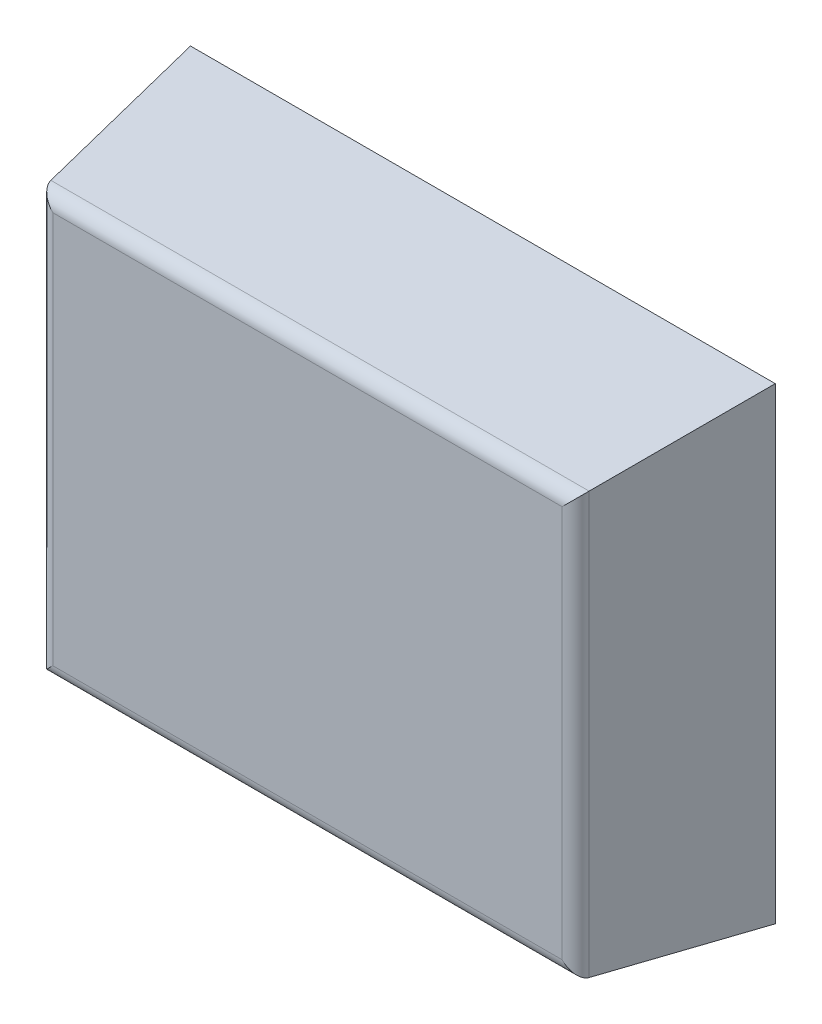
ISO-10303-21;
HEADER;
FILE_DESCRIPTION(('STEP AP214'),'2;1');
FILE_NAME('part.step','',(''),(''),'','','');
FILE_SCHEMA(('AUTOMOTIVE_DESIGN { 1 0 10303 214 1 1 1 1 }'));
ENDSEC;
DATA;
#1=APPLICATION_CONTEXT('core data for automotive mechanical design processes');
#2=APPLICATION_PROTOCOL_DEFINITION('international standard','automotive_design',2000,#1);
#3=PRODUCT_CONTEXT('',#1,'mechanical');
#4=PRODUCT('Part','Part','',(#3));
#5=PRODUCT_RELATED_PRODUCT_CATEGORY('part','',(#4));
#6=PRODUCT_DEFINITION_FORMATION('','',#4);
#7=PRODUCT_DEFINITION_CONTEXT('part definition',#1,'design');
#8=PRODUCT_DEFINITION('design','',#6,#7);
#9=PRODUCT_DEFINITION_SHAPE('','',#8);
#10=(LENGTH_UNIT() NAMED_UNIT(*) SI_UNIT(.MILLI.,.METRE.));
#11=(NAMED_UNIT(*) PLANE_ANGLE_UNIT() SI_UNIT($,.RADIAN.));
#12=(NAMED_UNIT(*) SI_UNIT($,.STERADIAN.) SOLID_ANGLE_UNIT());
#13=UNCERTAINTY_MEASURE_WITH_UNIT(LENGTH_MEASURE(1.E-05),#10,'distance_accuracy_value','');
#14=(GEOMETRIC_REPRESENTATION_CONTEXT(3) GLOBAL_UNCERTAINTY_ASSIGNED_CONTEXT((#13)) GLOBAL_UNIT_ASSIGNED_CONTEXT((#10,
#11,#12)) REPRESENTATION_CONTEXT('',''));
#15=CARTESIAN_POINT('',(0.,0.,0.));
#16=DIRECTION('',(0.,0.,1.));
#17=DIRECTION('',(1.,0.,0.));
#18=AXIS2_PLACEMENT_3D('',#15,#16,#17);
#19=CARTESIAN_POINT('',(0.5,0.75,0.85));
#20=DIRECTION('',(0.,0.989949493661206,0.141421356237029));
#21=DIRECTION('',(1.,0.,0.));
#22=AXIS2_PLACEMENT_3D('',#19,#20,#21);
#23=PLANE('',#22);
#24=DIRECTION('',(-1.,0.,0.));
#25=VECTOR('',#24,1.);
#26=CARTESIAN_POINT('',(0.25,0.720418418884,1.057071067812));
#27=LINE('',#26,#25);
#28=CARTESIAN_POINT('',(0.920418418894,0.720418418894,1.057071067813));
#29=VERTEX_POINT('',#28);
#30=CARTESIAN_POINT('',(-0.920418418894,0.720418418894,1.057071067813));
#31=VERTEX_POINT('',#30);
#32=EDGE_CURVE('E140',#29,#31,#27,.T.);
#33=ORIENTED_EDGE('',*,*,#32,.F.);
#34=DIRECTION('',(-0.140028008411036,-0.140028008411036,0.980196058817254));
#35=VECTOR('',#34,1.);
#36=CARTESIAN_POINT('',(0.9343137255,0.7343137255,0.959803921579));
#37=LINE('',#36,#35);
#38=CARTESIAN_POINT('',(1.,0.8,0.5));
#39=VERTEX_POINT('',#38);
#40=EDGE_CURVE('E119',#39,#29,#37,.T.);
#41=ORIENTED_EDGE('',*,*,#40,.F.);
#42=DIRECTION('',(-1.,0.,0.));
#43=VECTOR('',#42,1.);
#44=CARTESIAN_POINT('',(1.00000000001,0.80000000001,0.50000000001));
#45=LINE('',#44,#43);
#46=CARTESIAN_POINT('',(-1.,0.8,0.5));
#47=VERTEX_POINT('',#46);
#48=EDGE_CURVE('E11',#39,#47,#45,.T.);
#49=ORIENTED_EDGE('',*,*,#48,.T.);
#50=DIRECTION('',(-0.140028008411036,0.140028008411036,-0.980196058817254));
#51=VECTOR('',#50,1.);
#52=CARTESIAN_POINT('',(-0.932352941186,0.732352941186,0.973529411775));
#53=LINE('',#52,#51);
#54=EDGE_CURVE('E159',#31,#47,#53,.T.);
#55=ORIENTED_EDGE('',*,*,#54,.F.);
#56=EDGE_LOOP('',(#33,#41,#49,#55));
#57=FACE_BOUND('',#56,.T.);
#58=ADVANCED_FACE('F17',(#57),#23,.T.);
#59=CARTESIAN_POINT('',(0.,0.,0.5));
#60=DIRECTION('',(0.,0.,1.));
#61=DIRECTION('',(1.,0.,0.));
#62=AXIS2_PLACEMENT_3D('',#59,#60,#61);
#63=PLANE('',#62);
#64=ORIENTED_EDGE('',*,*,#48,.F.);
#65=DIRECTION('',(0.,1.,0.));
#66=VECTOR('',#65,1.);
#67=CARTESIAN_POINT('',(1.00000000001,-0.80000000001,0.50000000001));
#68=LINE('',#67,#66);
#69=CARTESIAN_POINT('',(1.,-0.8,0.5));
#70=VERTEX_POINT('',#69);
#71=EDGE_CURVE('E121',#70,#39,#68,.T.);
#72=ORIENTED_EDGE('',*,*,#71,.F.);
#73=DIRECTION('',(1.,0.,0.));
#74=VECTOR('',#73,1.);
#75=CARTESIAN_POINT('',(-1.00000000001,-0.80000000001,0.50000000001));
#76=LINE('',#75,#74);
#77=CARTESIAN_POINT('',(-1.,-0.8,0.5));
#78=VERTEX_POINT('',#77);
#79=EDGE_CURVE('E156',#78,#70,#76,.T.);
#80=ORIENTED_EDGE('',*,*,#79,.F.);
#81=DIRECTION('',(0.,-1.,0.));
#82=VECTOR('',#81,1.);
#83=CARTESIAN_POINT('',(-1.00000000001,0.80000000001,0.50000000001));
#84=LINE('',#83,#82);
#85=EDGE_CURVE('E25',#47,#78,#84,.T.);
#86=ORIENTED_EDGE('',*,*,#85,.F.);
#87=EDGE_LOOP('',(#64,#72,#80,#86));
#88=FACE_BOUND('',#87,.T.);
#89=ADVANCED_FACE('F199',(#88),#63,.F.);
#90=CARTESIAN_POINT('',(-0.95,0.4,0.85));
#91=DIRECTION('',(-0.989949493661206,0.,0.141421356237029));
#92=DIRECTION('',(0.,1.,0.));
#93=AXIS2_PLACEMENT_3D('',#90,#91,#92);
#94=PLANE('',#93);
#95=DIRECTION('',(0.,-1.,0.));
#96=VECTOR('',#95,1.);
#97=CARTESIAN_POINT('',(-0.920418418884,0.2,1.057071067812));
#98=LINE('',#97,#96);
#99=CARTESIAN_POINT('',(-0.920418418894,-0.720418418894,1.057071067813));
#100=VERTEX_POINT('',#99);
#101=EDGE_CURVE('E104',#31,#100,#98,.T.);
#102=ORIENTED_EDGE('',*,*,#101,.F.);
#103=ORIENTED_EDGE('',*,*,#54,.T.);
#104=ORIENTED_EDGE('',*,*,#85,.T.);
#105=DIRECTION('',(0.140028008411036,0.140028008411036,0.980196058817254));
#106=VECTOR('',#105,1.);
#107=CARTESIAN_POINT('',(-0.9343137255,-0.7343137255,0.959803921579));
#108=LINE('',#107,#106);
#109=EDGE_CURVE('E120',#78,#100,#108,.T.);
#110=ORIENTED_EDGE('',*,*,#109,.T.);
#111=EDGE_LOOP('',(#102,#103,#104,#110));
#112=FACE_BOUND('',#111,.T.);
#113=ADVANCED_FACE('F194',(#112),#94,.T.);
#114=CARTESIAN_POINT('',(0.,0.,1.1));
#115=DIRECTION('',(0.,0.,1.));
#116=DIRECTION('',(1.,0.,0.));
#117=AXIS2_PLACEMENT_3D('',#114,#115,#116);
#118=PLANE('',#117);
#119=DIRECTION('',(-1.,0.,0.));
#120=VECTOR('',#119,1.);
#121=CARTESIAN_POINT('',(-0.25,-0.670920944201,1.1));
#122=LINE('',#121,#120);
#123=CARTESIAN_POINT('',(0.870920944201,-0.670920944201,1.1));
#124=VERTEX_POINT('',#123);
#125=CARTESIAN_POINT('',(-0.870920944201,-0.670920944201,1.1));
#126=VERTEX_POINT('',#125);
#127=EDGE_CURVE('E89',#124,#126,#122,.T.);
#128=ORIENTED_EDGE('',*,*,#127,.F.);
#129=DIRECTION('',(0.,-1.,0.));
#130=VECTOR('',#129,1.);
#131=CARTESIAN_POINT('',(0.870920944201,-0.2,1.1));
#132=LINE('',#131,#130);
#133=CARTESIAN_POINT('',(0.870920944201,0.670920944201,1.1));
#134=VERTEX_POINT('',#133);
#135=EDGE_CURVE('E126',#134,#124,#132,.T.);
#136=ORIENTED_EDGE('',*,*,#135,.F.);
#137=DIRECTION('',(1.,0.,0.));
#138=VECTOR('',#137,1.);
#139=CARTESIAN_POINT('',(0.25,0.670920944201,1.1));
#140=LINE('',#139,#138);
#141=CARTESIAN_POINT('',(-0.870920944201,0.670920944201,1.1));
#142=VERTEX_POINT('',#141);
#143=EDGE_CURVE('E91',#142,#134,#140,.T.);
#144=ORIENTED_EDGE('',*,*,#143,.F.);
#145=DIRECTION('',(0.,1.,0.));
#146=VECTOR('',#145,1.);
#147=CARTESIAN_POINT('',(-0.870920944201,0.2,1.1));
#148=LINE('',#147,#146);
#149=EDGE_CURVE('E85',#126,#142,#148,.T.);
#150=ORIENTED_EDGE('',*,*,#149,.F.);
#151=EDGE_LOOP('',(#128,#136,#144,#150));
#152=FACE_BOUND('',#151,.T.);
#153=ADVANCED_FACE('F87',(#152),#118,.T.);
#154=CARTESIAN_POINT('',(-0.5,-0.75,0.85));
#155=DIRECTION('',(0.,-0.989949493661206,0.141421356237029));
#156=DIRECTION('',(-1.,0.,0.));
#157=AXIS2_PLACEMENT_3D('',#154,#155,#156);
#158=PLANE('',#157);
#159=DIRECTION('',(1.,0.,0.));
#160=VECTOR('',#159,1.);
#161=CARTESIAN_POINT('',(-0.25,-0.720418418884,1.057071067812));
#162=LINE('',#161,#160);
#163=CARTESIAN_POINT('',(0.920418418894,-0.720418418894,1.057071067813));
#164=VERTEX_POINT('',#163);
#165=EDGE_CURVE('E109',#100,#164,#162,.T.);
#166=ORIENTED_EDGE('',*,*,#165,.F.);
#167=ORIENTED_EDGE('',*,*,#109,.F.);
#168=ORIENTED_EDGE('',*,*,#79,.T.);
#169=DIRECTION('',(-0.140028008411036,0.140028008411036,0.980196058817254));
#170=VECTOR('',#169,1.);
#171=CARTESIAN_POINT('',(0.932352941186,-0.732352941186,0.973529411775));
#172=LINE('',#171,#170);
#173=EDGE_CURVE('E123',#70,#164,#172,.T.);
#174=ORIENTED_EDGE('',*,*,#173,.T.);
#175=EDGE_LOOP('',(#166,#167,#168,#174));
#176=FACE_BOUND('',#175,.T.);
#177=ADVANCED_FACE('F214',(#176),#158,.T.);
#178=CARTESIAN_POINT('',(0.95,-0.4,0.85));
#179=DIRECTION('',(0.989949493661206,0.,0.141421356237029));
#180=DIRECTION('',(0.,-1.,0.));
#181=AXIS2_PLACEMENT_3D('',#178,#179,#180);
#182=PLANE('',#181);
#183=DIRECTION('',(0.,1.,0.));
#184=VECTOR('',#183,1.);
#185=CARTESIAN_POINT('',(0.920418418884,-0.2,1.057071067812));
#186=LINE('',#185,#184);
#187=EDGE_CURVE('E137',#164,#29,#186,.T.);
#188=ORIENTED_EDGE('',*,*,#187,.F.);
#189=ORIENTED_EDGE('',*,*,#173,.F.);
#190=ORIENTED_EDGE('',*,*,#71,.T.);
#191=ORIENTED_EDGE('',*,*,#40,.T.);
#192=EDGE_LOOP('',(#188,#189,#190,#191));
#193=FACE_BOUND('',#192,.T.);
#194=ADVANCED_FACE('F208',(#193),#182,.T.);
#195=CARTESIAN_POINT('',(0.870920944201,-0.2,1.05));
#196=DIRECTION('',(0.,1.,0.));
#197=DIRECTION('',(0.65520174135991,0.,0.755453954995896));
#198=AXIS2_PLACEMENT_3D('',#195,#196,#197);
#199=CYLINDRICAL_SURFACE('',#198,0.05);
#200=ORIENTED_EDGE('',*,*,#187,.T.);
#201=CARTESIAN_POINT('',(0.870920944201,0.670920944201,1.05));
#202=DIRECTION('',(-0.707106781186548,0.707106781186548,0.));
#203=DIRECTION('',(-0.707106781186548,-0.707106781186548,0.));
#204=AXIS2_PLACEMENT_3D('',#201,#202,#203);
#205=ELLIPSE('',#204,0.07071067811865,0.05);
#206=EDGE_CURVE('E133',#134,#29,#205,.T.);
#207=ORIENTED_EDGE('',*,*,#206,.F.);
#208=ORIENTED_EDGE('',*,*,#135,.T.);
#209=CARTESIAN_POINT('',(0.870920944201,-0.670920944201,1.05));
#210=DIRECTION('',(0.707106781186548,0.707106781186548,0.));
#211=DIRECTION('',(0.707106781186548,-0.707106781186548,0.));
#212=AXIS2_PLACEMENT_3D('',#209,#210,#211);
#213=ELLIPSE('',#212,0.07071067811865,0.05);
#214=EDGE_CURVE('E97',#124,#164,#213,.T.);
#215=ORIENTED_EDGE('',*,*,#214,.T.);
#216=EDGE_LOOP('',(#200,#207,#208,#215));
#217=FACE_BOUND('',#216,.T.);
#218=ADVANCED_FACE('F188',(#217),#199,.T.);
#219=CARTESIAN_POINT('',(0.25,0.670920944201,1.05));
#220=DIRECTION('',(1.,0.,0.));
#221=DIRECTION('',(0.,0.65520174135991,0.755453954995896));
#222=AXIS2_PLACEMENT_3D('',#219,#220,#221);
#223=CYLINDRICAL_SURFACE('',#222,0.05);
#224=ORIENTED_EDGE('',*,*,#32,.T.);
#225=CARTESIAN_POINT('',(-0.870920944201,0.670920944201,1.05));
#226=DIRECTION('',(-0.707106781186548,-0.707106781186548,0.));
#227=DIRECTION('',(-0.707106781186548,0.707106781186548,0.));
#228=AXIS2_PLACEMENT_3D('',#225,#226,#227);
#229=ELLIPSE('',#228,0.07071067811865,0.05);
#230=EDGE_CURVE('E96',#142,#31,#229,.T.);
#231=ORIENTED_EDGE('',*,*,#230,.F.);
#232=ORIENTED_EDGE('',*,*,#143,.T.);
#233=ORIENTED_EDGE('',*,*,#206,.T.);
#234=EDGE_LOOP('',(#224,#231,#232,#233));
#235=FACE_BOUND('',#234,.T.);
#236=ADVANCED_FACE('F180',(#235),#223,.T.);
#237=CARTESIAN_POINT('',(-0.870920944201,0.2,1.05));
#238=DIRECTION('',(0.,-1.,0.));
#239=DIRECTION('',(-0.65520174135991,0.,0.755453954995896));
#240=AXIS2_PLACEMENT_3D('',#237,#238,#239);
#241=CYLINDRICAL_SURFACE('',#240,0.05);
#242=ORIENTED_EDGE('',*,*,#149,.T.);
#243=ORIENTED_EDGE('',*,*,#230,.T.);
#244=ORIENTED_EDGE('',*,*,#101,.T.);
#245=CARTESIAN_POINT('',(-0.870920944201,-0.670920944201,1.05));
#246=DIRECTION('',(0.707106781186548,-0.707106781186548,0.));
#247=DIRECTION('',(-0.707106781186548,-0.707106781186548,0.));
#248=AXIS2_PLACEMENT_3D('',#245,#246,#247);
#249=ELLIPSE('',#248,0.07071067811865,0.05);
#250=EDGE_CURVE('E101',#126,#100,#249,.T.);
#251=ORIENTED_EDGE('',*,*,#250,.F.);
#252=EDGE_LOOP('',(#242,#243,#244,#251));
#253=FACE_BOUND('',#252,.T.);
#254=ADVANCED_FACE('F102',(#253),#241,.T.);
#255=CARTESIAN_POINT('',(-0.25,-0.670920944201,1.05));
#256=DIRECTION('',(1.,0.,0.));
#257=DIRECTION('',(0.,-0.65520174135991,0.755453954995896));
#258=AXIS2_PLACEMENT_3D('',#255,#256,#257);
#259=CYLINDRICAL_SURFACE('',#258,0.05);
#260=ORIENTED_EDGE('',*,*,#127,.T.);
#261=ORIENTED_EDGE('',*,*,#250,.T.);
#262=ORIENTED_EDGE('',*,*,#165,.T.);
#263=ORIENTED_EDGE('',*,*,#214,.F.);
#264=EDGE_LOOP('',(#260,#261,#262,#263));
#265=FACE_BOUND('',#264,.T.);
#266=ADVANCED_FACE('F112',(#265),#259,.T.);
#267=CLOSED_SHELL('',(#58,#89,#113,#153,#177,#194,#218,#236,#254,#266));
#268=MANIFOLD_SOLID_BREP('B1',#267);
#269=ADVANCED_BREP_SHAPE_REPRESENTATION('',(#18,#268),#14);
#270=SHAPE_DEFINITION_REPRESENTATION(#9,#269);
ENDSEC;
END-ISO-10303-21;
